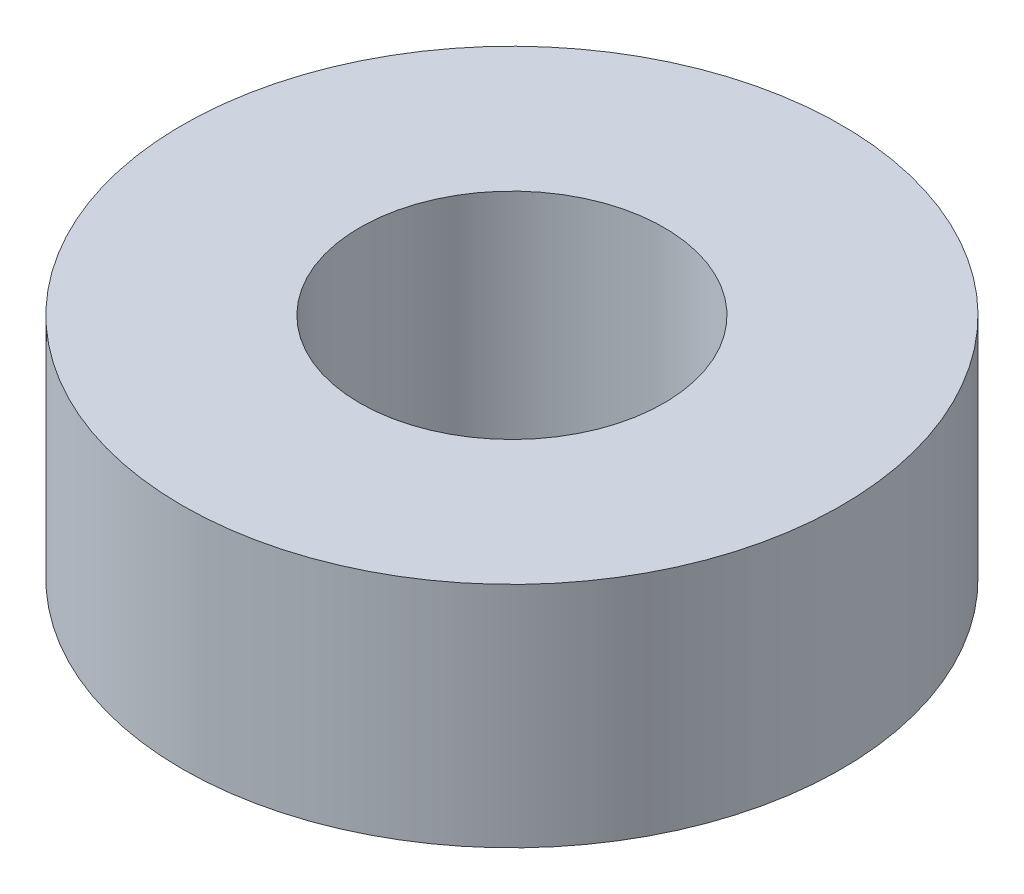
ISO-10303-21;
HEADER;
FILE_DESCRIPTION(('STEP AP214'),'2;1');
FILE_NAME('part.step','',(''),(''),'','','');
FILE_SCHEMA(('AUTOMOTIVE_DESIGN { 1 0 10303 214 1 1 1 1 }'));
ENDSEC;
DATA;
#1=APPLICATION_CONTEXT('core data for automotive mechanical design processes');
#2=APPLICATION_PROTOCOL_DEFINITION('international standard','automotive_design',2000,#1);
#3=PRODUCT_CONTEXT('',#1,'mechanical');
#4=PRODUCT('Part','Part','',(#3));
#5=PRODUCT_RELATED_PRODUCT_CATEGORY('part','',(#4));
#6=PRODUCT_DEFINITION_FORMATION('','',#4);
#7=PRODUCT_DEFINITION_CONTEXT('part definition',#1,'design');
#8=PRODUCT_DEFINITION('design','',#6,#7);
#9=PRODUCT_DEFINITION_SHAPE('','',#8);
#10=(LENGTH_UNIT() NAMED_UNIT(*) SI_UNIT(.MILLI.,.METRE.));
#11=(NAMED_UNIT(*) PLANE_ANGLE_UNIT() SI_UNIT($,.RADIAN.));
#12=(NAMED_UNIT(*) SI_UNIT($,.STERADIAN.) SOLID_ANGLE_UNIT());
#13=UNCERTAINTY_MEASURE_WITH_UNIT(LENGTH_MEASURE(1.E-05),#10,'distance_accuracy_value','');
#14=(GEOMETRIC_REPRESENTATION_CONTEXT(3) GLOBAL_UNCERTAINTY_ASSIGNED_CONTEXT((#13)) GLOBAL_UNIT_ASSIGNED_CONTEXT((#10,
#11,#12)) REPRESENTATION_CONTEXT('',''));
#15=CARTESIAN_POINT('',(0.,0.,0.));
#16=DIRECTION('',(0.,0.,1.));
#17=DIRECTION('',(1.,0.,0.));
#18=AXIS2_PLACEMENT_3D('',#15,#16,#17);
#19=CARTESIAN_POINT('',(0.,9.,0.));
#20=DIRECTION('',(0.,1.,0.));
#21=DIRECTION('',(0.,0.,1.));
#22=AXIS2_PLACEMENT_3D('',#19,#20,#21);
#23=PLANE('',#22);
#24=CARTESIAN_POINT('',(0.,9.,0.));
#25=DIRECTION('',(0.,1.,0.));
#26=DIRECTION('',(0.,0.,1.));
#27=AXIS2_PLACEMENT_3D('',#24,#25,#26);
#28=CIRCLE('',#27,13.);
#29=CARTESIAN_POINT('',(0.,9.,13.));
#30=VERTEX_POINT('',#29);
#31=EDGE_CURVE('E10',#30,#30,#28,.T.);
#32=ORIENTED_EDGE('',*,*,#31,.T.);
#33=EDGE_LOOP('',(#32));
#34=FACE_BOUND('',#33,.T.);
#35=CARTESIAN_POINT('',(0.,9.,0.));
#36=DIRECTION('',(0.,1.,0.));
#37=DIRECTION('',(0.,0.,1.));
#38=AXIS2_PLACEMENT_3D('',#35,#36,#37);
#39=CIRCLE('',#38,6.);
#40=CARTESIAN_POINT('',(0.,9.,6.));
#41=VERTEX_POINT('',#40);
#42=EDGE_CURVE('E42',#41,#41,#39,.T.);
#43=ORIENTED_EDGE('',*,*,#42,.F.);
#44=EDGE_LOOP('',(#43));
#45=FACE_BOUND('',#44,.T.);
#46=ADVANCED_FACE('F31',(#34,#45),#23,.T.);
#47=CARTESIAN_POINT('',(0.,0.,0.));
#48=DIRECTION('',(0.,1.,0.));
#49=DIRECTION('',(0.,0.,1.));
#50=AXIS2_PLACEMENT_3D('',#47,#48,#49);
#51=PLANE('',#50);
#52=CARTESIAN_POINT('',(0.,0.,0.));
#53=DIRECTION('',(0.,1.,0.));
#54=DIRECTION('',(0.,0.,1.));
#55=AXIS2_PLACEMENT_3D('',#52,#53,#54);
#56=CIRCLE('',#55,13.);
#57=CARTESIAN_POINT('',(0.,0.,13.));
#58=VERTEX_POINT('',#57);
#59=EDGE_CURVE('E35',#58,#58,#56,.T.);
#60=ORIENTED_EDGE('',*,*,#59,.F.);
#61=EDGE_LOOP('',(#60));
#62=FACE_BOUND('',#61,.T.);
#63=CARTESIAN_POINT('',(0.,0.,0.));
#64=DIRECTION('',(0.,1.,0.));
#65=DIRECTION('',(0.,0.,1.));
#66=AXIS2_PLACEMENT_3D('',#63,#64,#65);
#67=CIRCLE('',#66,6.);
#68=CARTESIAN_POINT('',(0.,0.,6.));
#69=VERTEX_POINT('',#68);
#70=EDGE_CURVE('E44',#69,#69,#67,.T.);
#71=ORIENTED_EDGE('',*,*,#70,.T.);
#72=EDGE_LOOP('',(#71));
#73=FACE_BOUND('',#72,.T.);
#74=ADVANCED_FACE('F54',(#62,#73),#51,.F.);
#75=CARTESIAN_POINT('',(0.,9.,0.));
#76=DIRECTION('',(0.,-1.,0.));
#77=DIRECTION('',(0.,0.,-1.));
#78=AXIS2_PLACEMENT_3D('',#75,#76,#77);
#79=CYLINDRICAL_SURFACE('',#78,13.);
#80=ORIENTED_EDGE('',*,*,#31,.F.);
#81=EDGE_LOOP('',(#80));
#82=FACE_BOUND('',#81,.T.);
#83=ORIENTED_EDGE('',*,*,#59,.T.);
#84=EDGE_LOOP('',(#83));
#85=FACE_BOUND('',#84,.T.);
#86=ADVANCED_FACE('F33',(#82,#85),#79,.T.);
#87=CARTESIAN_POINT('',(0.,9.,0.));
#88=DIRECTION('',(0.,-1.,0.));
#89=DIRECTION('',(0.,0.,-1.));
#90=AXIS2_PLACEMENT_3D('',#87,#88,#89);
#91=CYLINDRICAL_SURFACE('',#90,6.);
#92=ORIENTED_EDGE('',*,*,#42,.T.);
#93=EDGE_LOOP('',(#92));
#94=FACE_BOUND('',#93,.T.);
#95=ORIENTED_EDGE('',*,*,#70,.F.);
#96=EDGE_LOOP('',(#95));
#97=FACE_BOUND('',#96,.T.);
#98=ADVANCED_FACE('F50',(#94,#97),#91,.F.);
#99=CLOSED_SHELL('',(#46,#74,#86,#98));
#100=MANIFOLD_SOLID_BREP('B2',#99);
#101=ADVANCED_BREP_SHAPE_REPRESENTATION('',(#18,#100),#14);
#102=SHAPE_DEFINITION_REPRESENTATION(#9,#101);
ENDSEC;
END-ISO-10303-21;
